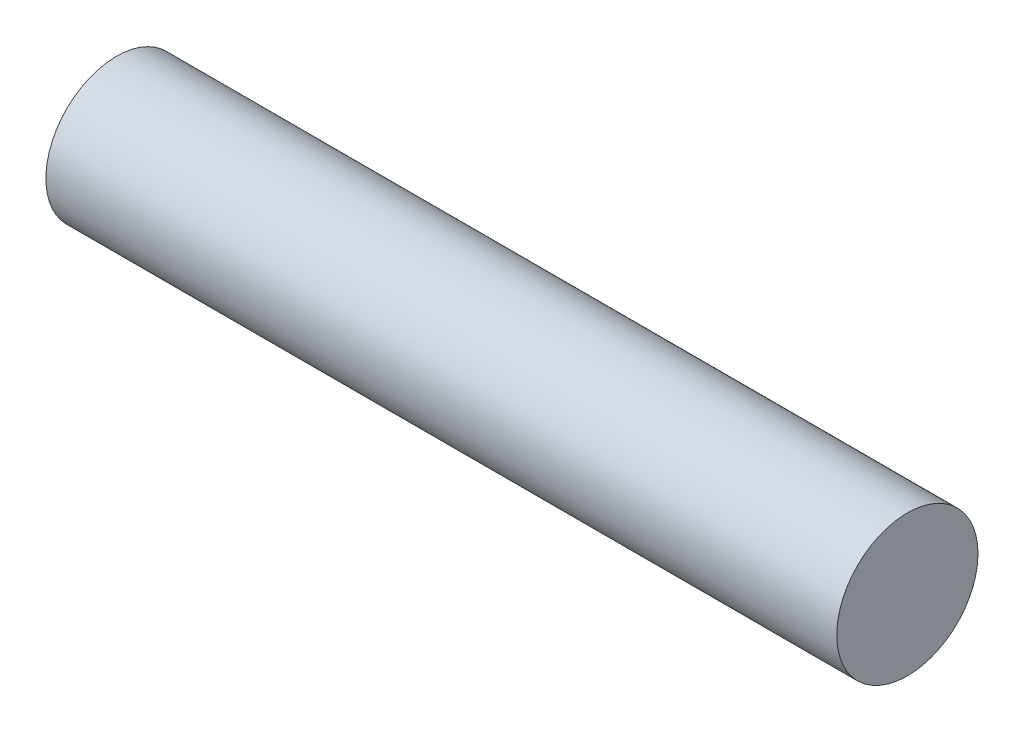
ISO-10303-21;
HEADER;
FILE_DESCRIPTION(('STEP AP214'),'2;1');
FILE_NAME('part.step','',(''),(''),'','','');
FILE_SCHEMA(('AUTOMOTIVE_DESIGN { 1 0 10303 214 1 1 1 1 }'));
ENDSEC;
DATA;
#1=APPLICATION_CONTEXT('core data for automotive mechanical design processes');
#2=APPLICATION_PROTOCOL_DEFINITION('international standard','automotive_design',2000,#1);
#3=PRODUCT_CONTEXT('',#1,'mechanical');
#4=PRODUCT('Part','Part','',(#3));
#5=PRODUCT_RELATED_PRODUCT_CATEGORY('part','',(#4));
#6=PRODUCT_DEFINITION_FORMATION('','',#4);
#7=PRODUCT_DEFINITION_CONTEXT('part definition',#1,'design');
#8=PRODUCT_DEFINITION('design','',#6,#7);
#9=PRODUCT_DEFINITION_SHAPE('','',#8);
#10=(LENGTH_UNIT() NAMED_UNIT(*) SI_UNIT(.MILLI.,.METRE.));
#11=(NAMED_UNIT(*) PLANE_ANGLE_UNIT() SI_UNIT($,.RADIAN.));
#12=(NAMED_UNIT(*) SI_UNIT($,.STERADIAN.) SOLID_ANGLE_UNIT());
#13=UNCERTAINTY_MEASURE_WITH_UNIT(LENGTH_MEASURE(1.E-05),#10,'distance_accuracy_value','');
#14=(GEOMETRIC_REPRESENTATION_CONTEXT(3) GLOBAL_UNCERTAINTY_ASSIGNED_CONTEXT((#13)) GLOBAL_UNIT_ASSIGNED_CONTEXT((#10,
#11,#12)) REPRESENTATION_CONTEXT('',''));
#15=CARTESIAN_POINT('',(0.,0.,0.));
#16=DIRECTION('',(0.,0.,1.));
#17=DIRECTION('',(1.,0.,0.));
#18=AXIS2_PLACEMENT_3D('',#15,#16,#17);
#19=CARTESIAN_POINT('',(28.,0.,0.));
#20=DIRECTION('',(-1.,0.,0.));
#21=DIRECTION('',(0.,0.,1.));
#22=AXIS2_PLACEMENT_3D('',#19,#20,#21);
#23=CYLINDRICAL_SURFACE('',#22,2.5);
#24=CARTESIAN_POINT('',(28.,0.,0.));
#25=DIRECTION('',(1.,0.,0.));
#26=DIRECTION('',(0.,0.,-1.));
#27=AXIS2_PLACEMENT_3D('',#24,#25,#26);
#28=CIRCLE('',#27,2.5);
#29=CARTESIAN_POINT('',(28.,0.,-2.5));
#30=VERTEX_POINT('',#29);
#31=EDGE_CURVE('E10',#30,#30,#28,.T.);
#32=ORIENTED_EDGE('',*,*,#31,.F.);
#33=EDGE_LOOP('',(#32));
#34=FACE_BOUND('',#33,.T.);
#35=CARTESIAN_POINT('',(0.,0.,0.));
#36=DIRECTION('',(1.,0.,0.));
#37=DIRECTION('',(0.,0.,-1.));
#38=AXIS2_PLACEMENT_3D('',#35,#36,#37);
#39=CIRCLE('',#38,2.5);
#40=CARTESIAN_POINT('',(0.,0.,-2.5));
#41=VERTEX_POINT('',#40);
#42=EDGE_CURVE('E46',#41,#41,#39,.T.);
#43=ORIENTED_EDGE('',*,*,#42,.T.);
#44=EDGE_LOOP('',(#43));
#45=FACE_BOUND('',#44,.T.);
#46=ADVANCED_FACE('F43',(#34,#45),#23,.T.);
#47=CARTESIAN_POINT('',(28.,0.,0.));
#48=DIRECTION('',(1.,0.,0.));
#49=DIRECTION('',(0.,0.,-1.));
#50=AXIS2_PLACEMENT_3D('',#47,#48,#49);
#51=PLANE('',#50);
#52=ORIENTED_EDGE('',*,*,#31,.T.);
#53=EDGE_LOOP('',(#52));
#54=FACE_BOUND('',#53,.T.);
#55=ADVANCED_FACE('F60',(#54),#51,.T.);
#56=CARTESIAN_POINT('',(0.,0.,0.));
#57=DIRECTION('',(1.,0.,0.));
#58=DIRECTION('',(0.,0.,-1.));
#59=AXIS2_PLACEMENT_3D('',#56,#57,#58);
#60=PLANE('',#59);
#61=ORIENTED_EDGE('',*,*,#42,.F.);
#62=EDGE_LOOP('',(#61));
#63=FACE_BOUND('',#62,.T.);
#64=ADVANCED_FACE('F58',(#63),#60,.F.);
#65=CLOSED_SHELL('',(#46,#55,#64));
#66=MANIFOLD_SOLID_BREP('B2',#65);
#67=ADVANCED_BREP_SHAPE_REPRESENTATION('',(#18,#66),#14);
#68=SHAPE_DEFINITION_REPRESENTATION(#9,#67);
ENDSEC;
END-ISO-10303-21;
